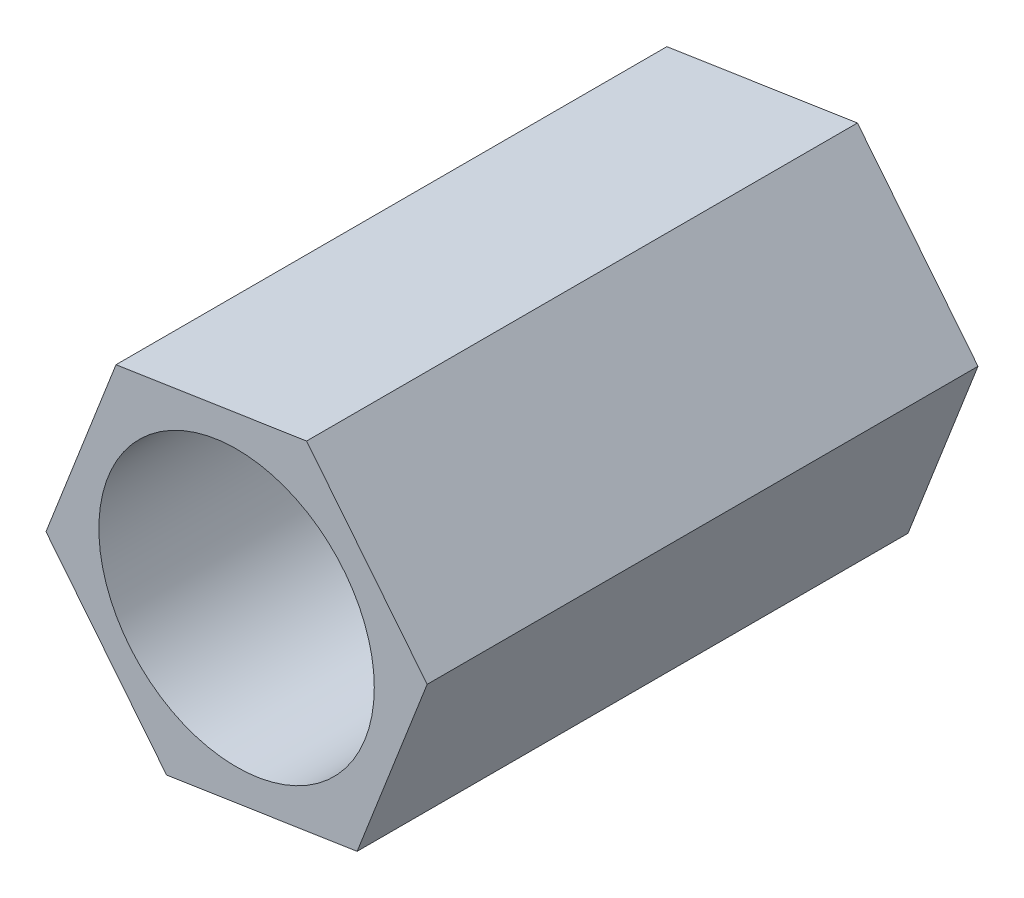
ISO-10303-21;
HEADER;
FILE_DESCRIPTION(('STEP AP214'),'2;1');
FILE_NAME('part.step','',(''),(''),'','','');
FILE_SCHEMA(('AUTOMOTIVE_DESIGN { 1 0 10303 214 1 1 1 1 }'));
ENDSEC;
DATA;
#1=APPLICATION_CONTEXT('core data for automotive mechanical design processes');
#2=APPLICATION_PROTOCOL_DEFINITION('international standard','automotive_design',2000,#1);
#3=PRODUCT_CONTEXT('',#1,'mechanical');
#4=PRODUCT('Part','Part','',(#3));
#5=PRODUCT_RELATED_PRODUCT_CATEGORY('part','',(#4));
#6=PRODUCT_DEFINITION_FORMATION('','',#4);
#7=PRODUCT_DEFINITION_CONTEXT('part definition',#1,'design');
#8=PRODUCT_DEFINITION('design','',#6,#7);
#9=PRODUCT_DEFINITION_SHAPE('','',#8);
#10=(LENGTH_UNIT() NAMED_UNIT(*) SI_UNIT(.MILLI.,.METRE.));
#11=(NAMED_UNIT(*) PLANE_ANGLE_UNIT() SI_UNIT($,.RADIAN.));
#12=(NAMED_UNIT(*) SI_UNIT($,.STERADIAN.) SOLID_ANGLE_UNIT());
#13=UNCERTAINTY_MEASURE_WITH_UNIT(LENGTH_MEASURE(1.E-05),#10,'distance_accuracy_value','');
#14=(GEOMETRIC_REPRESENTATION_CONTEXT(3) GLOBAL_UNCERTAINTY_ASSIGNED_CONTEXT((#13)) GLOBAL_UNIT_ASSIGNED_CONTEXT((#10,
#11,#12)) REPRESENTATION_CONTEXT('',''));
#15=CARTESIAN_POINT('',(0.,0.,0.));
#16=DIRECTION('',(0.,0.,1.));
#17=DIRECTION('',(1.,0.,0.));
#18=AXIS2_PLACEMENT_3D('',#15,#16,#17);
#19=CARTESIAN_POINT('',(0.,0.,5.));
#20=DIRECTION('',(0.,0.,1.));
#21=DIRECTION('',(1.,0.,0.));
#22=AXIS2_PLACEMENT_3D('',#19,#20,#21);
#23=PLANE('',#22);
#24=CARTESIAN_POINT('',(0.,0.,5.));
#25=DIRECTION('',(0.,0.,1.));
#26=DIRECTION('',(1.,0.,0.));
#27=AXIS2_PLACEMENT_3D('',#24,#25,#26);
#28=CIRCLE('',#27,1.25);
#29=CARTESIAN_POINT('',(1.25,0.,5.));
#30=VERTEX_POINT('',#29);
#31=EDGE_CURVE('E177',#30,#30,#28,.T.);
#32=ORIENTED_EDGE('',*,*,#31,.F.);
#33=EDGE_LOOP('',(#32));
#34=FACE_BOUND('',#33,.T.);
#35=DIRECTION('',(-0.363133680946227,-0.931737049688614,0.));
#36=VECTOR('',#35,1.);
#37=CARTESIAN_POINT('',(-1.41208892068563,0.550345237171075,5.));
#38=LINE('',#37,#36);
#39=CARTESIAN_POINT('',(-1.09434694985769,1.36561515564861,5.));
#40=VERTEX_POINT('',#39);
#41=CARTESIAN_POINT('',(-1.72983089151358,-0.264924681306465,5.));
#42=VERTEX_POINT('',#41);
#43=EDGE_CURVE('E149',#40,#42,#38,.T.);
#44=ORIENTED_EDGE('',*,*,#43,.T.);
#45=DIRECTION('',(0.62534111420439,-0.780351517513493,0.));
#46=VECTOR('',#45,1.);
#47=CARTESIAN_POINT('',(-1.18265741658474,-0.947732259130768,5.));
#48=LINE('',#47,#46);
#49=CARTESIAN_POINT('',(-0.635483941655896,-1.63053983695508,5.));
#50=VERTEX_POINT('',#49);
#51=EDGE_CURVE('E130',#42,#50,#48,.T.);
#52=ORIENTED_EDGE('',*,*,#51,.T.);
#53=DIRECTION('',(0.988474795150618,0.151385532175121,0.));
#54=VECTOR('',#53,1.);
#55=CARTESIAN_POINT('',(0.229431504100893,-1.49807749630184,5.));
#56=LINE('',#55,#54);
#57=CARTESIAN_POINT('',(1.09434694985768,-1.36561515564861,5.));
#58=VERTEX_POINT('',#57);
#59=EDGE_CURVE('E146',#50,#58,#56,.T.);
#60=ORIENTED_EDGE('',*,*,#59,.T.);
#61=DIRECTION('',(0.363133680946227,0.931737049688615,0.));
#62=VECTOR('',#61,1.);
#63=CARTESIAN_POINT('',(1.41208892068563,-0.550345237171075,5.));
#64=LINE('',#63,#62);
#65=CARTESIAN_POINT('',(1.72983089151358,0.264924681306464,5.));
#66=VERTEX_POINT('',#65);
#67=EDGE_CURVE('E197',#58,#66,#64,.T.);
#68=ORIENTED_EDGE('',*,*,#67,.T.);
#69=DIRECTION('',(-0.62534111420439,0.780351517513493,0.));
#70=VECTOR('',#69,1.);
#71=CARTESIAN_POINT('',(1.18265741658474,0.947732259130768,5.));
#72=LINE('',#71,#70);
#73=CARTESIAN_POINT('',(0.635483941655895,1.63053983695508,5.));
#74=VERTEX_POINT('',#73);
#75=EDGE_CURVE('E155',#66,#74,#72,.T.);
#76=ORIENTED_EDGE('',*,*,#75,.T.);
#77=DIRECTION('',(-0.988474795150618,-0.151385532175121,0.));
#78=VECTOR('',#77,1.);
#79=CARTESIAN_POINT('',(-0.229431504100893,1.49807749630184,5.));
#80=LINE('',#79,#78);
#81=EDGE_CURVE('E161',#74,#40,#80,.T.);
#82=ORIENTED_EDGE('',*,*,#81,.T.);
#83=EDGE_LOOP('',(#44,#52,#60,#68,#76,#82));
#84=FACE_BOUND('',#83,.T.);
#85=ADVANCED_FACE('F75',(#34,#84),#23,.T.);
#86=CARTESIAN_POINT('',(0.,0.,0.));
#87=DIRECTION('',(0.,0.,1.));
#88=DIRECTION('',(1.,0.,0.));
#89=AXIS2_PLACEMENT_3D('',#86,#87,#88);
#90=PLANE('',#89);
#91=CARTESIAN_POINT('',(0.,0.,0.));
#92=DIRECTION('',(0.,0.,1.));
#93=DIRECTION('',(1.,0.,0.));
#94=AXIS2_PLACEMENT_3D('',#91,#92,#93);
#95=CIRCLE('',#94,1.25);
#96=CARTESIAN_POINT('',(1.25,0.,0.));
#97=VERTEX_POINT('',#96);
#98=EDGE_CURVE('E176',#97,#97,#95,.T.);
#99=ORIENTED_EDGE('',*,*,#98,.T.);
#100=EDGE_LOOP('',(#99));
#101=FACE_BOUND('',#100,.T.);
#102=DIRECTION('',(0.62534111420439,-0.780351517513493,0.));
#103=VECTOR('',#102,1.);
#104=CARTESIAN_POINT('',(-1.18265741658474,-0.947732259130768,0.));
#105=LINE('',#104,#103);
#106=CARTESIAN_POINT('',(-1.72983089151358,-0.264924681306465,0.));
#107=VERTEX_POINT('',#106);
#108=CARTESIAN_POINT('',(-0.635483941655896,-1.63053983695508,0.));
#109=VERTEX_POINT('',#108);
#110=EDGE_CURVE('E133',#107,#109,#105,.T.);
#111=ORIENTED_EDGE('',*,*,#110,.F.);
#112=DIRECTION('',(-0.363133680946227,-0.931737049688614,0.));
#113=VECTOR('',#112,1.);
#114=CARTESIAN_POINT('',(-1.41208892068563,0.550345237171075,0.));
#115=LINE('',#114,#113);
#116=CARTESIAN_POINT('',(-1.09434694985769,1.36561515564861,0.));
#117=VERTEX_POINT('',#116);
#118=EDGE_CURVE('E172',#117,#107,#115,.T.);
#119=ORIENTED_EDGE('',*,*,#118,.F.);
#120=DIRECTION('',(-0.988474795150618,-0.151385532175121,0.));
#121=VECTOR('',#120,1.);
#122=CARTESIAN_POINT('',(-0.229431504100893,1.49807749630184,0.));
#123=LINE('',#122,#121);
#124=CARTESIAN_POINT('',(0.635483941655895,1.63053983695508,0.));
#125=VERTEX_POINT('',#124);
#126=EDGE_CURVE('E91',#125,#117,#123,.T.);
#127=ORIENTED_EDGE('',*,*,#126,.F.);
#128=DIRECTION('',(-0.62534111420439,0.780351517513493,0.));
#129=VECTOR('',#128,1.);
#130=CARTESIAN_POINT('',(1.18265741658474,0.947732259130768,0.));
#131=LINE('',#130,#129);
#132=CARTESIAN_POINT('',(1.72983089151358,0.264924681306464,0.));
#133=VERTEX_POINT('',#132);
#134=EDGE_CURVE('E168',#133,#125,#131,.T.);
#135=ORIENTED_EDGE('',*,*,#134,.F.);
#136=DIRECTION('',(0.363133680946227,0.931737049688615,0.));
#137=VECTOR('',#136,1.);
#138=CARTESIAN_POINT('',(1.41208892068563,-0.550345237171075,0.));
#139=LINE('',#138,#137);
#140=CARTESIAN_POINT('',(1.09434694985768,-1.36561515564861,0.));
#141=VERTEX_POINT('',#140);
#142=EDGE_CURVE('E98',#141,#133,#139,.T.);
#143=ORIENTED_EDGE('',*,*,#142,.F.);
#144=DIRECTION('',(0.988474795150618,0.151385532175121,0.));
#145=VECTOR('',#144,1.);
#146=CARTESIAN_POINT('',(0.229431504100893,-1.49807749630184,0.));
#147=LINE('',#146,#145);
#148=EDGE_CURVE('E165',#109,#141,#147,.T.);
#149=ORIENTED_EDGE('',*,*,#148,.F.);
#150=EDGE_LOOP('',(#111,#119,#127,#135,#143,#149));
#151=FACE_BOUND('',#150,.T.);
#152=ADVANCED_FACE('F77',(#101,#151),#90,.F.);
#153=CARTESIAN_POINT('',(0.,0.,5.));
#154=DIRECTION('',(0.,0.,-1.));
#155=DIRECTION('',(-1.,0.,0.));
#156=AXIS2_PLACEMENT_3D('',#153,#154,#155);
#157=CYLINDRICAL_SURFACE('',#156,1.25);
#158=ORIENTED_EDGE('',*,*,#31,.T.);
#159=EDGE_LOOP('',(#158));
#160=FACE_BOUND('',#159,.T.);
#161=ORIENTED_EDGE('',*,*,#98,.F.);
#162=EDGE_LOOP('',(#161));
#163=FACE_BOUND('',#162,.T.);
#164=ADVANCED_FACE('F225',(#160,#163),#157,.F.);
#165=CARTESIAN_POINT('',(0.229431504100893,-1.49807749630184,-7.));
#166=DIRECTION('',(0.151385532175121,-0.988474795150617,0.));
#167=DIRECTION('',(0.988474795150618,0.151385532175121,0.));
#168=AXIS2_PLACEMENT_3D('',#165,#166,#167);
#169=PLANE('',#168);
#170=ORIENTED_EDGE('',*,*,#148,.T.);
#171=DIRECTION('',(0.,0.,-1.));
#172=VECTOR('',#171,1.);
#173=CARTESIAN_POINT('',(1.09434694985769,-1.36561515564861,5.));
#174=LINE('',#173,#172);
#175=EDGE_CURVE('E140',#141,#58,#174,.F.);
#176=ORIENTED_EDGE('',*,*,#175,.T.);
#177=ORIENTED_EDGE('',*,*,#59,.F.);
#178=DIRECTION('',(0.,0.,-1.));
#179=VECTOR('',#178,1.);
#180=CARTESIAN_POINT('',(-0.635483941655901,-1.63053983695507,5.));
#181=LINE('',#180,#179);
#182=EDGE_CURVE('E127',#50,#109,#181,.T.);
#183=ORIENTED_EDGE('',*,*,#182,.T.);
#184=EDGE_LOOP('',(#170,#176,#177,#183));
#185=FACE_BOUND('',#184,.T.);
#186=ADVANCED_FACE('F153',(#185),#169,.T.);
#187=CARTESIAN_POINT('',(1.18265741658474,0.947732259130768,-7.));
#188=DIRECTION('',(0.780351517513493,0.62534111420439,0.));
#189=DIRECTION('',(-0.62534111420439,0.780351517513493,0.));
#190=AXIS2_PLACEMENT_3D('',#187,#188,#189);
#191=PLANE('',#190);
#192=ORIENTED_EDGE('',*,*,#134,.T.);
#193=DIRECTION('',(0.,0.,-1.));
#194=VECTOR('',#193,1.);
#195=CARTESIAN_POINT('',(0.635483941655894,1.63053983695508,5.));
#196=LINE('',#195,#194);
#197=EDGE_CURVE('E139',#125,#74,#196,.F.);
#198=ORIENTED_EDGE('',*,*,#197,.T.);
#199=ORIENTED_EDGE('',*,*,#75,.F.);
#200=DIRECTION('',(0.,0.,-1.));
#201=VECTOR('',#200,1.);
#202=CARTESIAN_POINT('',(1.72983089151358,0.264924681306459,5.));
#203=LINE('',#202,#201);
#204=EDGE_CURVE('E189',#66,#133,#203,.T.);
#205=ORIENTED_EDGE('',*,*,#204,.T.);
#206=EDGE_LOOP('',(#192,#198,#199,#205));
#207=FACE_BOUND('',#206,.T.);
#208=ADVANCED_FACE('F209',(#207),#191,.T.);
#209=CARTESIAN_POINT('',(-1.41208892068563,0.550345237171075,-7.));
#210=DIRECTION('',(-0.931737049688614,0.363133680946227,0.));
#211=DIRECTION('',(-0.363133680946227,-0.931737049688614,0.));
#212=AXIS2_PLACEMENT_3D('',#209,#210,#211);
#213=PLANE('',#212);
#214=ORIENTED_EDGE('',*,*,#118,.T.);
#215=DIRECTION('',(0.,0.,-1.));
#216=VECTOR('',#215,1.);
#217=CARTESIAN_POINT('',(-1.72983089151358,-0.264924681306465,5.));
#218=LINE('',#217,#216);
#219=EDGE_CURVE('E84',#107,#42,#218,.F.);
#220=ORIENTED_EDGE('',*,*,#219,.T.);
#221=ORIENTED_EDGE('',*,*,#43,.F.);
#222=DIRECTION('',(0.,0.,-1.));
#223=VECTOR('',#222,1.);
#224=CARTESIAN_POINT('',(-1.09434694985768,1.36561515564862,5.));
#225=LINE('',#224,#223);
#226=EDGE_CURVE('E12',#40,#117,#225,.T.);
#227=ORIENTED_EDGE('',*,*,#226,.T.);
#228=EDGE_LOOP('',(#214,#220,#221,#227));
#229=FACE_BOUND('',#228,.T.);
#230=ADVANCED_FACE('F193',(#229),#213,.T.);
#231=CARTESIAN_POINT('',(-0.229431504100893,1.49807749630184,-7.));
#232=DIRECTION('',(-0.151385532175121,0.988474795150617,0.));
#233=DIRECTION('',(-0.988474795150618,-0.151385532175121,0.));
#234=AXIS2_PLACEMENT_3D('',#231,#232,#233);
#235=PLANE('',#234);
#236=ORIENTED_EDGE('',*,*,#126,.T.);
#237=ORIENTED_EDGE('',*,*,#226,.F.);
#238=ORIENTED_EDGE('',*,*,#81,.F.);
#239=ORIENTED_EDGE('',*,*,#197,.F.);
#240=EDGE_LOOP('',(#236,#237,#238,#239));
#241=FACE_BOUND('',#240,.T.);
#242=ADVANCED_FACE('F207',(#241),#235,.T.);
#243=CARTESIAN_POINT('',(1.41208892068563,-0.550345237171075,-7.));
#244=DIRECTION('',(0.931737049688614,-0.363133680946227,0.));
#245=DIRECTION('',(0.363133680946227,0.931737049688615,0.));
#246=AXIS2_PLACEMENT_3D('',#243,#244,#245);
#247=PLANE('',#246);
#248=ORIENTED_EDGE('',*,*,#142,.T.);
#249=ORIENTED_EDGE('',*,*,#204,.F.);
#250=ORIENTED_EDGE('',*,*,#67,.F.);
#251=ORIENTED_EDGE('',*,*,#175,.F.);
#252=EDGE_LOOP('',(#248,#249,#250,#251));
#253=FACE_BOUND('',#252,.T.);
#254=ADVANCED_FACE('F211',(#253),#247,.T.);
#255=CARTESIAN_POINT('',(-1.18265741658474,-0.947732259130768,-7.));
#256=DIRECTION('',(-0.780351517513493,-0.62534111420439,0.));
#257=DIRECTION('',(0.62534111420439,-0.780351517513493,0.));
#258=AXIS2_PLACEMENT_3D('',#255,#256,#257);
#259=PLANE('',#258);
#260=ORIENTED_EDGE('',*,*,#110,.T.);
#261=ORIENTED_EDGE('',*,*,#182,.F.);
#262=ORIENTED_EDGE('',*,*,#51,.F.);
#263=ORIENTED_EDGE('',*,*,#219,.F.);
#264=EDGE_LOOP('',(#260,#261,#262,#263));
#265=FACE_BOUND('',#264,.T.);
#266=ADVANCED_FACE('F129',(#265),#259,.T.);
#267=CLOSED_SHELL('',(#85,#152,#164,#186,#208,#230,#242,#254,#266));
#268=MANIFOLD_SOLID_BREP('B2',#267);
#269=ADVANCED_BREP_SHAPE_REPRESENTATION('',(#18,#268),#14);
#270=SHAPE_DEFINITION_REPRESENTATION(#9,#269);
ENDSEC;
END-ISO-10303-21;
